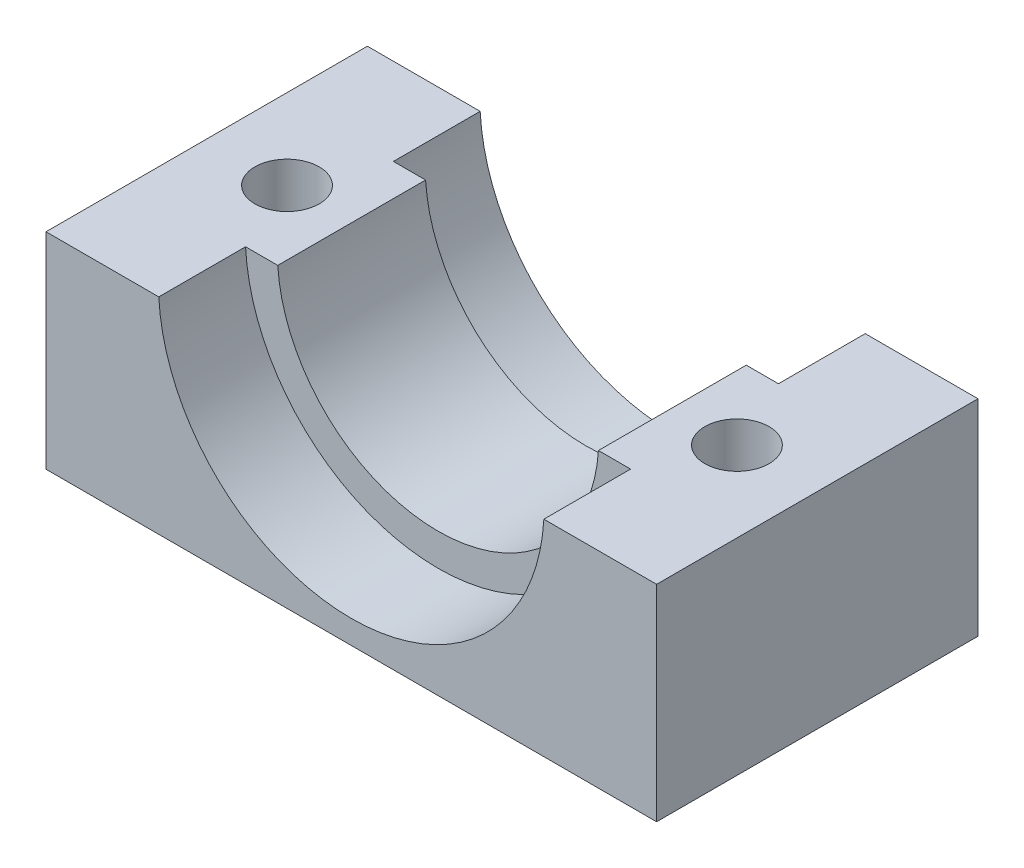
ISO-10303-21;
HEADER;
FILE_DESCRIPTION(('STEP AP214'),'2;1');
FILE_NAME('part.step','',(''),(''),'','','');
FILE_SCHEMA(('AUTOMOTIVE_DESIGN { 1 0 10303 214 1 1 1 1 }'));
ENDSEC;
DATA;
#1=APPLICATION_CONTEXT('core data for automotive mechanical design processes');
#2=APPLICATION_PROTOCOL_DEFINITION('international standard','automotive_design',2000,#1);
#3=PRODUCT_CONTEXT('',#1,'mechanical');
#4=PRODUCT('Part','Part','',(#3));
#5=PRODUCT_RELATED_PRODUCT_CATEGORY('part','',(#4));
#6=PRODUCT_DEFINITION_FORMATION('','',#4);
#7=PRODUCT_DEFINITION_CONTEXT('part definition',#1,'design');
#8=PRODUCT_DEFINITION('design','',#6,#7);
#9=PRODUCT_DEFINITION_SHAPE('','',#8);
#10=(LENGTH_UNIT() NAMED_UNIT(*) SI_UNIT(.MILLI.,.METRE.));
#11=(NAMED_UNIT(*) PLANE_ANGLE_UNIT() SI_UNIT($,.RADIAN.));
#12=(NAMED_UNIT(*) SI_UNIT($,.STERADIAN.) SOLID_ANGLE_UNIT());
#13=UNCERTAINTY_MEASURE_WITH_UNIT(LENGTH_MEASURE(1.E-05),#10,'distance_accuracy_value','');
#14=(GEOMETRIC_REPRESENTATION_CONTEXT(3) GLOBAL_UNCERTAINTY_ASSIGNED_CONTEXT((#13)) GLOBAL_UNIT_ASSIGNED_CONTEXT((#10,
#11,#12)) REPRESENTATION_CONTEXT('',''));
#15=CARTESIAN_POINT('',(0.,0.,0.));
#16=DIRECTION('',(0.,0.,1.));
#17=DIRECTION('',(1.,0.,0.));
#18=AXIS2_PLACEMENT_3D('',#15,#16,#17);
#19=CARTESIAN_POINT('',(47.5,16.,25.));
#20=DIRECTION('',(0.,-1.,0.));
#21=DIRECTION('',(0.,0.,-1.));
#22=AXIS2_PLACEMENT_3D('',#19,#20,#21);
#23=PLANE('',#22);
#24=CARTESIAN_POINT('',(35.,16.,0.));
#25=DIRECTION('',(0.,1.,0.));
#26=DIRECTION('',(0.,0.,1.));
#27=AXIS2_PLACEMENT_3D('',#24,#25,#26);
#28=CIRCLE('',#27,5.);
#29=CARTESIAN_POINT('',(35.,16.,4.99999999999998));
#30=VERTEX_POINT('',#29);
#31=EDGE_CURVE('E243',#30,#30,#28,.T.);
#32=ORIENTED_EDGE('',*,*,#31,.F.);
#33=EDGE_LOOP('',(#32));
#34=FACE_BOUND('',#33,.T.);
#35=DIRECTION('',(1.,0.,0.));
#36=VECTOR('',#35,1.);
#37=CARTESIAN_POINT('',(47.5,16.,11.5));
#38=LINE('',#37,#36);
#39=CARTESIAN_POINT('',(24.9454905744505,16.,11.5));
#40=VERTEX_POINT('',#39);
#41=CARTESIAN_POINT('',(29.9545906331567,16.,11.5));
#42=VERTEX_POINT('',#41);
#43=EDGE_CURVE('E43',#40,#42,#38,.T.);
#44=ORIENTED_EDGE('',*,*,#43,.T.);
#45=DIRECTION('',(0.,0.,1.));
#46=VECTOR('',#45,1.);
#47=CARTESIAN_POINT('',(29.9545906331567,16.,-20.2491264575217));
#48=LINE('',#47,#46);
#49=CARTESIAN_POINT('',(29.9545906331567,16.,25.));
#50=VERTEX_POINT('',#49);
#51=EDGE_CURVE('E11',#42,#50,#48,.T.);
#52=ORIENTED_EDGE('',*,*,#51,.T.);
#53=DIRECTION('',(-1.,0.,0.));
#54=VECTOR('',#53,1.);
#55=CARTESIAN_POINT('',(47.5,16.,25.));
#56=LINE('',#55,#54);
#57=CARTESIAN_POINT('',(47.5,16.,25.));
#58=VERTEX_POINT('',#57);
#59=EDGE_CURVE('E148',#58,#50,#56,.T.);
#60=ORIENTED_EDGE('',*,*,#59,.F.);
#61=DIRECTION('',(0.,0.,1.));
#62=VECTOR('',#61,1.);
#63=CARTESIAN_POINT('',(47.5,16.,25.));
#64=LINE('',#63,#62);
#65=CARTESIAN_POINT('',(47.5,16.,-25.));
#66=VERTEX_POINT('',#65);
#67=EDGE_CURVE('E59',#66,#58,#64,.T.);
#68=ORIENTED_EDGE('',*,*,#67,.F.);
#69=DIRECTION('',(-1.,0.,0.));
#70=VECTOR('',#69,1.);
#71=CARTESIAN_POINT('',(47.5,16.,-25.));
#72=LINE('',#71,#70);
#73=CARTESIAN_POINT('',(29.9545906331567,16.,-25.));
#74=VERTEX_POINT('',#73);
#75=EDGE_CURVE('E137',#66,#74,#72,.T.);
#76=ORIENTED_EDGE('',*,*,#75,.T.);
#77=DIRECTION('',(0.,0.,1.));
#78=VECTOR('',#77,1.);
#79=CARTESIAN_POINT('',(29.9545906331567,16.,-20.2491264575217));
#80=LINE('',#79,#78);
#81=CARTESIAN_POINT('',(29.9545906331567,16.,-11.5));
#82=VERTEX_POINT('',#81);
#83=EDGE_CURVE('E122',#74,#82,#80,.T.);
#84=ORIENTED_EDGE('',*,*,#83,.T.);
#85=DIRECTION('',(-1.,0.,0.));
#86=VECTOR('',#85,1.);
#87=CARTESIAN_POINT('',(47.5,16.,-11.5));
#88=LINE('',#87,#86);
#89=CARTESIAN_POINT('',(24.9454905744505,16.,-11.5));
#90=VERTEX_POINT('',#89);
#91=EDGE_CURVE('E129',#82,#90,#88,.T.);
#92=ORIENTED_EDGE('',*,*,#91,.T.);
#93=DIRECTION('',(0.,0.,1.));
#94=VECTOR('',#93,1.);
#95=CARTESIAN_POINT('',(24.9454905744505,16.,-20.2491264575217));
#96=LINE('',#95,#94);
#97=EDGE_CURVE('E166',#90,#40,#96,.T.);
#98=ORIENTED_EDGE('',*,*,#97,.T.);
#99=EDGE_LOOP('',(#44,#52,#60,#68,#76,#84,#92,#98));
#100=FACE_BOUND('',#99,.T.);
#101=ADVANCED_FACE('F34',(#34,#100),#23,.F.);
#102=CARTESIAN_POINT('',(47.5,16.,25.));
#103=DIRECTION('',(0.,0.,-1.));
#104=DIRECTION('',(0.,1.,0.));
#105=AXIS2_PLACEMENT_3D('',#102,#103,#104);
#106=PLANE('',#105);
#107=ORIENTED_EDGE('',*,*,#59,.T.);
#108=CARTESIAN_POINT('',(0.,17.6500000000001,25.));
#109=DIRECTION('',(0.,0.,1.));
#110=DIRECTION('',(1.,0.,0.));
#111=AXIS2_PLACEMENT_3D('',#108,#109,#110);
#112=CIRCLE('',#111,30.);
#113=CARTESIAN_POINT('',(-29.9545906331567,16.,25.));
#114=VERTEX_POINT('',#113);
#115=EDGE_CURVE('E183',#114,#50,#112,.T.);
#116=ORIENTED_EDGE('',*,*,#115,.F.);
#117=CARTESIAN_POINT('',(-47.5,16.,25.));
#118=VERTEX_POINT('',#117);
#119=EDGE_CURVE('E81',#114,#118,#56,.T.);
#120=ORIENTED_EDGE('',*,*,#119,.T.);
#121=DIRECTION('',(0.,-1.,0.));
#122=VECTOR('',#121,1.);
#123=CARTESIAN_POINT('',(-47.5,16.,25.));
#124=LINE('',#123,#122);
#125=CARTESIAN_POINT('',(-47.5,-16.,25.));
#126=VERTEX_POINT('',#125);
#127=EDGE_CURVE('E185',#118,#126,#124,.T.);
#128=ORIENTED_EDGE('',*,*,#127,.T.);
#129=DIRECTION('',(-1.,0.,0.));
#130=VECTOR('',#129,1.);
#131=CARTESIAN_POINT('',(47.5,-16.,25.));
#132=LINE('',#131,#130);
#133=CARTESIAN_POINT('',(47.5,-16.,25.));
#134=VERTEX_POINT('',#133);
#135=EDGE_CURVE('E146',#134,#126,#132,.T.);
#136=ORIENTED_EDGE('',*,*,#135,.F.);
#137=DIRECTION('',(0.,-1.,0.));
#138=VECTOR('',#137,1.);
#139=CARTESIAN_POINT('',(47.5,16.,25.));
#140=LINE('',#139,#138);
#141=EDGE_CURVE('E186',#58,#134,#140,.T.);
#142=ORIENTED_EDGE('',*,*,#141,.F.);
#143=EDGE_LOOP('',(#107,#116,#120,#128,#136,#142));
#144=FACE_BOUND('',#143,.T.);
#145=ADVANCED_FACE('F36',(#144),#106,.F.);
#146=CARTESIAN_POINT('',(47.5,-16.,25.));
#147=DIRECTION('',(0.,1.,0.));
#148=DIRECTION('',(0.,0.,1.));
#149=AXIS2_PLACEMENT_3D('',#146,#147,#148);
#150=PLANE('',#149);
#151=CARTESIAN_POINT('',(35.,-16.,0.));
#152=DIRECTION('',(0.,1.,0.));
#153=DIRECTION('',(0.,0.,1.));
#154=AXIS2_PLACEMENT_3D('',#151,#152,#153);
#155=CIRCLE('',#154,5.);
#156=CARTESIAN_POINT('',(35.,-16.,4.99999999999998));
#157=VERTEX_POINT('',#156);
#158=EDGE_CURVE('E38',#157,#157,#155,.T.);
#159=ORIENTED_EDGE('',*,*,#158,.T.);
#160=EDGE_LOOP('',(#159));
#161=FACE_BOUND('',#160,.T.);
#162=CARTESIAN_POINT('',(-35.,-16.,0.));
#163=DIRECTION('',(0.,1.,0.));
#164=DIRECTION('',(0.,0.,1.));
#165=AXIS2_PLACEMENT_3D('',#162,#163,#164);
#166=CIRCLE('',#165,5.);
#167=CARTESIAN_POINT('',(-35.,-16.,5.));
#168=VERTEX_POINT('',#167);
#169=EDGE_CURVE('E140',#168,#168,#166,.T.);
#170=ORIENTED_EDGE('',*,*,#169,.T.);
#171=EDGE_LOOP('',(#170));
#172=FACE_BOUND('',#171,.T.);
#173=DIRECTION('',(0.,0.,-1.));
#174=VECTOR('',#173,1.);
#175=CARTESIAN_POINT('',(-47.5,-16.,25.));
#176=LINE('',#175,#174);
#177=CARTESIAN_POINT('',(-47.5,-16.,-25.));
#178=VERTEX_POINT('',#177);
#179=EDGE_CURVE('E194',#126,#178,#176,.T.);
#180=ORIENTED_EDGE('',*,*,#179,.T.);
#181=DIRECTION('',(-1.,0.,0.));
#182=VECTOR('',#181,1.);
#183=CARTESIAN_POINT('',(47.5,-16.,-25.));
#184=LINE('',#183,#182);
#185=CARTESIAN_POINT('',(47.5,-16.,-25.));
#186=VERTEX_POINT('',#185);
#187=EDGE_CURVE('E143',#186,#178,#184,.T.);
#188=ORIENTED_EDGE('',*,*,#187,.F.);
#189=DIRECTION('',(0.,0.,-1.));
#190=VECTOR('',#189,1.);
#191=CARTESIAN_POINT('',(47.5,-16.,25.));
#192=LINE('',#191,#190);
#193=EDGE_CURVE('E89',#134,#186,#192,.T.);
#194=ORIENTED_EDGE('',*,*,#193,.F.);
#195=ORIENTED_EDGE('',*,*,#135,.T.);
#196=EDGE_LOOP('',(#180,#188,#194,#195));
#197=FACE_BOUND('',#196,.T.);
#198=ADVANCED_FACE('F207',(#161,#172,#197),#150,.F.);
#199=CARTESIAN_POINT('',(47.5,16.,-25.));
#200=DIRECTION('',(0.,0.,1.));
#201=DIRECTION('',(0.,-1.,0.));
#202=AXIS2_PLACEMENT_3D('',#199,#200,#201);
#203=PLANE('',#202);
#204=CARTESIAN_POINT('',(-29.9545906331567,16.,-25.));
#205=VERTEX_POINT('',#204);
#206=CARTESIAN_POINT('',(-47.5,16.,-25.));
#207=VERTEX_POINT('',#206);
#208=EDGE_CURVE('E139',#205,#207,#72,.T.);
#209=ORIENTED_EDGE('',*,*,#208,.F.);
#210=CARTESIAN_POINT('',(0.,17.6500000000001,-25.));
#211=DIRECTION('',(0.,0.,1.));
#212=DIRECTION('',(1.,0.,0.));
#213=AXIS2_PLACEMENT_3D('',#210,#211,#212);
#214=CIRCLE('',#213,30.);
#215=EDGE_CURVE('E50',#205,#74,#214,.T.);
#216=ORIENTED_EDGE('',*,*,#215,.T.);
#217=ORIENTED_EDGE('',*,*,#75,.F.);
#218=DIRECTION('',(0.,1.,0.));
#219=VECTOR('',#218,1.);
#220=CARTESIAN_POINT('',(47.5,16.,-25.));
#221=LINE('',#220,#219);
#222=EDGE_CURVE('E190',#186,#66,#221,.T.);
#223=ORIENTED_EDGE('',*,*,#222,.F.);
#224=ORIENTED_EDGE('',*,*,#187,.T.);
#225=DIRECTION('',(0.,1.,0.));
#226=VECTOR('',#225,1.);
#227=CARTESIAN_POINT('',(-47.5,16.,-25.));
#228=LINE('',#227,#226);
#229=EDGE_CURVE('E196',#178,#207,#228,.T.);
#230=ORIENTED_EDGE('',*,*,#229,.T.);
#231=EDGE_LOOP('',(#209,#216,#217,#223,#224,#230));
#232=FACE_BOUND('',#231,.T.);
#233=ADVANCED_FACE('F135',(#232),#203,.F.);
#234=CARTESIAN_POINT('',(-35.,16.,0.));
#235=DIRECTION('',(0.,1.,0.));
#236=DIRECTION('',(0.,0.,1.));
#237=AXIS2_PLACEMENT_3D('',#234,#235,#236);
#238=CIRCLE('',#237,5.);
#239=CARTESIAN_POINT('',(-35.,16.,5.));
#240=VERTEX_POINT('',#239);
#241=EDGE_CURVE('E238',#240,#240,#238,.T.);
#242=ORIENTED_EDGE('',*,*,#241,.F.);
#243=EDGE_LOOP('',(#242));
#244=FACE_BOUND('',#243,.T.);
#245=ORIENTED_EDGE('',*,*,#119,.F.);
#246=DIRECTION('',(0.,0.,1.));
#247=VECTOR('',#246,1.);
#248=CARTESIAN_POINT('',(-29.9545906331567,16.,-20.2491264575217));
#249=LINE('',#248,#247);
#250=CARTESIAN_POINT('',(-29.9545906331567,16.,11.5));
#251=VERTEX_POINT('',#250);
#252=EDGE_CURVE('E130',#114,#251,#249,.F.);
#253=ORIENTED_EDGE('',*,*,#252,.T.);
#254=CARTESIAN_POINT('',(-24.9454905744505,16.,11.5));
#255=VERTEX_POINT('',#254);
#256=EDGE_CURVE('E161',#251,#255,#38,.T.);
#257=ORIENTED_EDGE('',*,*,#256,.T.);
#258=DIRECTION('',(0.,0.,1.));
#259=VECTOR('',#258,1.);
#260=CARTESIAN_POINT('',(-24.9454905744505,16.,-20.2491264575217));
#261=LINE('',#260,#259);
#262=CARTESIAN_POINT('',(-24.9454905744505,16.,-11.5));
#263=VERTEX_POINT('',#262);
#264=EDGE_CURVE('E158',#255,#263,#261,.F.);
#265=ORIENTED_EDGE('',*,*,#264,.T.);
#266=CARTESIAN_POINT('',(-29.9545906331567,16.,-11.5));
#267=VERTEX_POINT('',#266);
#268=EDGE_CURVE('E155',#263,#267,#88,.T.);
#269=ORIENTED_EDGE('',*,*,#268,.T.);
#270=DIRECTION('',(0.,0.,1.));
#271=VECTOR('',#270,1.);
#272=CARTESIAN_POINT('',(-29.9545906331567,16.,-20.2491264575217));
#273=LINE('',#272,#271);
#274=EDGE_CURVE('E153',#267,#205,#273,.F.);
#275=ORIENTED_EDGE('',*,*,#274,.T.);
#276=ORIENTED_EDGE('',*,*,#208,.T.);
#277=DIRECTION('',(0.,0.,1.));
#278=VECTOR('',#277,1.);
#279=CARTESIAN_POINT('',(-47.5,16.,25.));
#280=LINE('',#279,#278);
#281=EDGE_CURVE('E188',#207,#118,#280,.T.);
#282=ORIENTED_EDGE('',*,*,#281,.T.);
#283=EDGE_LOOP('',(#245,#253,#257,#265,#269,#275,#276,#282));
#284=FACE_BOUND('',#283,.T.);
#285=ADVANCED_FACE('F200',(#244,#284),#23,.F.);
#286=CARTESIAN_POINT('',(47.5,0.,0.));
#287=DIRECTION('',(1.,0.,0.));
#288=DIRECTION('',(0.,0.,-1.));
#289=AXIS2_PLACEMENT_3D('',#286,#287,#288);
#290=PLANE('',#289);
#291=ORIENTED_EDGE('',*,*,#141,.T.);
#292=ORIENTED_EDGE('',*,*,#193,.T.);
#293=ORIENTED_EDGE('',*,*,#222,.T.);
#294=ORIENTED_EDGE('',*,*,#67,.T.);
#295=EDGE_LOOP('',(#291,#292,#293,#294));
#296=FACE_BOUND('',#295,.T.);
#297=ADVANCED_FACE('F208',(#296),#290,.T.);
#298=CARTESIAN_POINT('',(-47.5,0.,0.));
#299=DIRECTION('',(1.,0.,0.));
#300=DIRECTION('',(0.,0.,-1.));
#301=AXIS2_PLACEMENT_3D('',#298,#299,#300);
#302=PLANE('',#301);
#303=ORIENTED_EDGE('',*,*,#127,.F.);
#304=ORIENTED_EDGE('',*,*,#281,.F.);
#305=ORIENTED_EDGE('',*,*,#229,.F.);
#306=ORIENTED_EDGE('',*,*,#179,.F.);
#307=EDGE_LOOP('',(#303,#304,#305,#306));
#308=FACE_BOUND('',#307,.T.);
#309=ADVANCED_FACE('F203',(#308),#302,.F.);
#310=CARTESIAN_POINT('',(0.,17.6500000000001,-20.2491264575217));
#311=DIRECTION('',(0.,0.,1.));
#312=DIRECTION('',(1.,0.,0.));
#313=AXIS2_PLACEMENT_3D('',#310,#311,#312);
#314=CYLINDRICAL_SURFACE('',#313,30.);
#315=CARTESIAN_POINT('',(0.,17.6500000000001,11.5));
#316=DIRECTION('',(0.,0.,1.));
#317=DIRECTION('',(1.,0.,0.));
#318=AXIS2_PLACEMENT_3D('',#315,#316,#317);
#319=CIRCLE('',#318,30.);
#320=EDGE_CURVE('E177',#251,#42,#319,.T.);
#321=ORIENTED_EDGE('',*,*,#320,.F.);
#322=ORIENTED_EDGE('',*,*,#252,.F.);
#323=ORIENTED_EDGE('',*,*,#115,.T.);
#324=ORIENTED_EDGE('',*,*,#51,.F.);
#325=EDGE_LOOP('',(#321,#322,#323,#324));
#326=FACE_BOUND('',#325,.T.);
#327=ADVANCED_FACE('F215',(#326),#314,.F.);
#328=CARTESIAN_POINT('',(0.,-12.3499999999999,11.5));
#329=DIRECTION('',(0.,0.,-1.));
#330=DIRECTION('',(-1.,0.,0.));
#331=AXIS2_PLACEMENT_3D('',#328,#329,#330);
#332=PLANE('',#331);
#333=ORIENTED_EDGE('',*,*,#320,.T.);
#334=ORIENTED_EDGE('',*,*,#43,.F.);
#335=CARTESIAN_POINT('',(0.,17.6500000000001,11.5));
#336=DIRECTION('',(0.,0.,1.));
#337=DIRECTION('',(1.,0.,0.));
#338=AXIS2_PLACEMENT_3D('',#335,#336,#337);
#339=CIRCLE('',#338,25.);
#340=EDGE_CURVE('E174',#255,#40,#339,.T.);
#341=ORIENTED_EDGE('',*,*,#340,.F.);
#342=ORIENTED_EDGE('',*,*,#256,.F.);
#343=EDGE_LOOP('',(#333,#334,#341,#342));
#344=FACE_BOUND('',#343,.T.);
#345=ADVANCED_FACE('F264',(#344),#332,.F.);
#346=CARTESIAN_POINT('',(0.,17.6500000000001,-20.2491264575217));
#347=DIRECTION('',(0.,0.,1.));
#348=DIRECTION('',(1.,0.,0.));
#349=AXIS2_PLACEMENT_3D('',#346,#347,#348);
#350=CYLINDRICAL_SURFACE('',#349,25.);
#351=CARTESIAN_POINT('',(0.,17.6500000000001,-11.5));
#352=DIRECTION('',(0.,0.,1.));
#353=DIRECTION('',(1.,0.,0.));
#354=AXIS2_PLACEMENT_3D('',#351,#352,#353);
#355=CIRCLE('',#354,25.);
#356=EDGE_CURVE('E172',#263,#90,#355,.T.);
#357=ORIENTED_EDGE('',*,*,#356,.F.);
#358=ORIENTED_EDGE('',*,*,#264,.F.);
#359=ORIENTED_EDGE('',*,*,#340,.T.);
#360=ORIENTED_EDGE('',*,*,#97,.F.);
#361=EDGE_LOOP('',(#357,#358,#359,#360));
#362=FACE_BOUND('',#361,.T.);
#363=ADVANCED_FACE('F261',(#362),#350,.F.);
#364=CARTESIAN_POINT('',(0.,-7.34999999999992,-11.5));
#365=DIRECTION('',(0.,0.,1.));
#366=DIRECTION('',(1.,0.,0.));
#367=AXIS2_PLACEMENT_3D('',#364,#365,#366);
#368=PLANE('',#367);
#369=CARTESIAN_POINT('',(0.,17.6500000000001,-11.5));
#370=DIRECTION('',(0.,0.,1.));
#371=DIRECTION('',(1.,0.,0.));
#372=AXIS2_PLACEMENT_3D('',#369,#370,#371);
#373=CIRCLE('',#372,30.);
#374=EDGE_CURVE('E125',#267,#82,#373,.T.);
#375=ORIENTED_EDGE('',*,*,#374,.F.);
#376=ORIENTED_EDGE('',*,*,#268,.F.);
#377=ORIENTED_EDGE('',*,*,#356,.T.);
#378=ORIENTED_EDGE('',*,*,#91,.F.);
#379=EDGE_LOOP('',(#375,#376,#377,#378));
#380=FACE_BOUND('',#379,.T.);
#381=ADVANCED_FACE('F170',(#380),#368,.F.);
#382=CARTESIAN_POINT('',(0.,17.6500000000001,-20.2491264575217));
#383=DIRECTION('',(0.,0.,1.));
#384=DIRECTION('',(1.,0.,0.));
#385=AXIS2_PLACEMENT_3D('',#382,#383,#384);
#386=CYLINDRICAL_SURFACE('',#385,30.);
#387=ORIENTED_EDGE('',*,*,#215,.F.);
#388=ORIENTED_EDGE('',*,*,#274,.F.);
#389=ORIENTED_EDGE('',*,*,#374,.T.);
#390=ORIENTED_EDGE('',*,*,#83,.F.);
#391=EDGE_LOOP('',(#387,#388,#389,#390));
#392=FACE_BOUND('',#391,.T.);
#393=ADVANCED_FACE('F123',(#392),#386,.F.);
#394=CARTESIAN_POINT('',(-35.,-59.,0.));
#395=DIRECTION('',(0.,1.,0.));
#396=DIRECTION('',(0.,0.,1.));
#397=AXIS2_PLACEMENT_3D('',#394,#395,#396);
#398=CYLINDRICAL_SURFACE('',#397,5.);
#399=ORIENTED_EDGE('',*,*,#241,.T.);
#400=EDGE_LOOP('',(#399));
#401=FACE_BOUND('',#400,.T.);
#402=ORIENTED_EDGE('',*,*,#169,.F.);
#403=EDGE_LOOP('',(#402));
#404=FACE_BOUND('',#403,.T.);
#405=ADVANCED_FACE('F249',(#401,#404),#398,.F.);
#406=CARTESIAN_POINT('',(35.,-59.,0.));
#407=DIRECTION('',(0.,1.,0.));
#408=DIRECTION('',(0.,0.,1.));
#409=AXIS2_PLACEMENT_3D('',#406,#407,#408);
#410=CYLINDRICAL_SURFACE('',#409,5.);
#411=ORIENTED_EDGE('',*,*,#31,.T.);
#412=EDGE_LOOP('',(#411));
#413=FACE_BOUND('',#412,.T.);
#414=ORIENTED_EDGE('',*,*,#158,.F.);
#415=EDGE_LOOP('',(#414));
#416=FACE_BOUND('',#415,.T.);
#417=ADVANCED_FACE('F246',(#413,#416),#410,.F.);
#418=CLOSED_SHELL('',(#101,#145,#198,#233,#285,#297,#309,#327,#345,#363,#381,#393,#405,#417));
#419=MANIFOLD_SOLID_BREP('B2',#418);
#420=ADVANCED_BREP_SHAPE_REPRESENTATION('',(#18,#419),#14);
#421=SHAPE_DEFINITION_REPRESENTATION(#9,#420);
ENDSEC;
END-ISO-10303-21;
